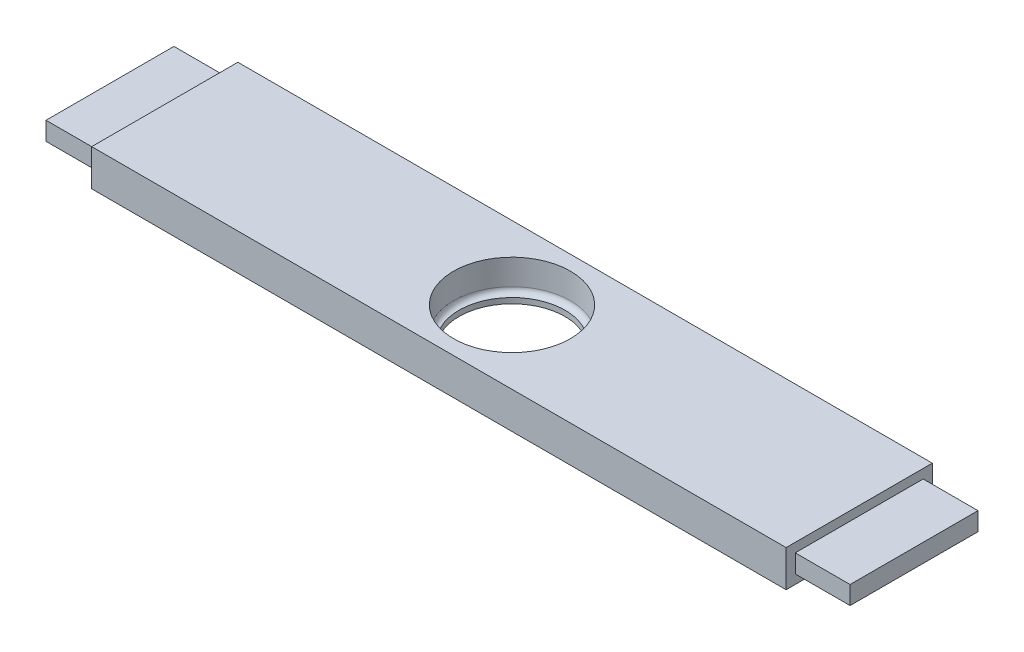
ISO-10303-21;
HEADER;
FILE_DESCRIPTION(('STEP AP214'),'2;1');
FILE_NAME('part.step','',(''),(''),'','','');
FILE_SCHEMA(('AUTOMOTIVE_DESIGN { 1 0 10303 214 1 1 1 1 }'));
ENDSEC;
DATA;
#1=APPLICATION_CONTEXT('core data for automotive mechanical design processes');
#2=APPLICATION_PROTOCOL_DEFINITION('international standard','automotive_design',2000,#1);
#3=PRODUCT_CONTEXT('',#1,'mechanical');
#4=PRODUCT('Part','Part','',(#3));
#5=PRODUCT_RELATED_PRODUCT_CATEGORY('part','',(#4));
#6=PRODUCT_DEFINITION_FORMATION('','',#4);
#7=PRODUCT_DEFINITION_CONTEXT('part definition',#1,'design');
#8=PRODUCT_DEFINITION('design','',#6,#7);
#9=PRODUCT_DEFINITION_SHAPE('','',#8);
#10=(LENGTH_UNIT() NAMED_UNIT(*) SI_UNIT(.MILLI.,.METRE.));
#11=(NAMED_UNIT(*) PLANE_ANGLE_UNIT() SI_UNIT($,.RADIAN.));
#12=(NAMED_UNIT(*) SI_UNIT($,.STERADIAN.) SOLID_ANGLE_UNIT());
#13=UNCERTAINTY_MEASURE_WITH_UNIT(LENGTH_MEASURE(1.E-05),#10,'distance_accuracy_value','');
#14=(GEOMETRIC_REPRESENTATION_CONTEXT(3) GLOBAL_UNCERTAINTY_ASSIGNED_CONTEXT((#13)) GLOBAL_UNIT_ASSIGNED_CONTEXT((#10,
#11,#12)) REPRESENTATION_CONTEXT('',''));
#15=CARTESIAN_POINT('',(0.,0.,0.));
#16=DIRECTION('',(0.,0.,1.));
#17=DIRECTION('',(1.,0.,0.));
#18=AXIS2_PLACEMENT_3D('',#15,#16,#17);
#19=CARTESIAN_POINT('',(0.,10.,0.));
#20=DIRECTION('',(0.,-1.,0.));
#21=DIRECTION('',(0.,0.,-1.));
#22=AXIS2_PLACEMENT_3D('',#19,#20,#21);
#23=PLANE('',#22);
#24=DIRECTION('',(0.,0.,-1.));
#25=VECTOR('',#24,1.);
#26=CARTESIAN_POINT('',(205.,10.,-40.));
#27=LINE('',#26,#25);
#28=CARTESIAN_POINT('',(205.,10.,0.));
#29=VERTEX_POINT('',#28);
#30=CARTESIAN_POINT('',(205.,10.,-40.));
#31=VERTEX_POINT('',#30);
#32=EDGE_CURVE('E175',#29,#31,#27,.T.);
#33=ORIENTED_EDGE('',*,*,#32,.T.);
#34=DIRECTION('',(-1.,0.,0.));
#35=VECTOR('',#34,1.);
#36=CARTESIAN_POINT('',(0.,10.,-40.));
#37=LINE('',#36,#35);
#38=CARTESIAN_POINT('',(15.,10.,-40.));
#39=VERTEX_POINT('',#38);
#40=EDGE_CURVE('E49',#31,#39,#37,.T.);
#41=ORIENTED_EDGE('',*,*,#40,.T.);
#42=DIRECTION('',(0.,0.,-1.));
#43=VECTOR('',#42,1.);
#44=CARTESIAN_POINT('',(15.,10.,-40.));
#45=LINE('',#44,#43);
#46=CARTESIAN_POINT('',(15.,10.,0.));
#47=VERTEX_POINT('',#46);
#48=EDGE_CURVE('E221',#47,#39,#45,.T.);
#49=ORIENTED_EDGE('',*,*,#48,.F.);
#50=DIRECTION('',(1.,0.,0.));
#51=VECTOR('',#50,1.);
#52=CARTESIAN_POINT('',(0.,10.,0.));
#53=LINE('',#52,#51);
#54=EDGE_CURVE('E225',#47,#29,#53,.T.);
#55=ORIENTED_EDGE('',*,*,#54,.T.);
#56=EDGE_LOOP('',(#33,#41,#49,#55));
#57=FACE_BOUND('',#56,.T.);
#58=CARTESIAN_POINT('',(110.,10.,-20.));
#59=DIRECTION('',(0.,-1.,0.));
#60=DIRECTION('',(0.,0.,-1.));
#61=AXIS2_PLACEMENT_3D('',#58,#59,#60);
#62=CIRCLE('',#61,16.);
#63=CARTESIAN_POINT('',(110.,10.,-36.));
#64=VERTEX_POINT('',#63);
#65=EDGE_CURVE('E234',#64,#64,#62,.F.);
#66=ORIENTED_EDGE('',*,*,#65,.F.);
#67=EDGE_LOOP('',(#66));
#68=FACE_BOUND('',#67,.T.);
#69=ADVANCED_FACE('F41',(#57,#68),#23,.F.);
#70=CARTESIAN_POINT('',(110.,-1.2E-05,-20.));
#71=DIRECTION('',(0.,1.,0.));
#72=DIRECTION('',(0.,0.,1.));
#73=AXIS2_PLACEMENT_3D('',#70,#71,#72);
#74=CYLINDRICAL_SURFACE('',#73,14.5);
#75=CARTESIAN_POINT('',(110.,0.,-20.));
#76=DIRECTION('',(0.,-1.,0.));
#77=DIRECTION('',(0.,0.,-1.));
#78=AXIS2_PLACEMENT_3D('',#75,#76,#77);
#79=CIRCLE('',#78,14.5);
#80=CARTESIAN_POINT('',(110.,0.,-5.50000000000001));
#81=VERTEX_POINT('',#80);
#82=EDGE_CURVE('E165',#81,#81,#79,.T.);
#83=CARTESIAN_POINT('',(110.,1.5,-20.));
#84=DIRECTION('',(0.,1.,0.));
#85=DIRECTION('',(0.,0.,1.));
#86=AXIS2_PLACEMENT_3D('',#83,#84,#85);
#87=CIRCLE('',#86,14.5);
#88=CARTESIAN_POINT('',(110.,1.5,-5.50000000000001));
#89=VERTEX_POINT('',#88);
#90=EDGE_CURVE('E159',#89,#89,#87,.T.);
#91=CARTESIAN_POINT('',(110.,0.,-5.50000000000001));
#92=CARTESIAN_POINT('',(110.,0.015625,-5.50000000000001));
#93=CARTESIAN_POINT('',(110.,0.03125,-5.50000000000001));
#94=CARTESIAN_POINT('',(110.,0.0625,-5.50000000000001));
#95=CARTESIAN_POINT('',(110.,0.078125,-5.50000000000001));
#96=CARTESIAN_POINT('',(110.,0.109375,-5.50000000000001));
#97=CARTESIAN_POINT('',(110.,0.125,-5.50000000000001));
#98=CARTESIAN_POINT('',(110.,0.15625,-5.50000000000001));
#99=CARTESIAN_POINT('',(110.,0.171875,-5.50000000000001));
#100=CARTESIAN_POINT('',(110.,0.203125,-5.50000000000001));
#101=CARTESIAN_POINT('',(110.,0.21875,-5.50000000000001));
#102=CARTESIAN_POINT('',(110.,0.25,-5.50000000000001));
#103=CARTESIAN_POINT('',(110.,0.265625,-5.50000000000001));
#104=CARTESIAN_POINT('',(110.,0.296875,-5.50000000000001));
#105=CARTESIAN_POINT('',(110.,0.3125,-5.50000000000001));
#106=CARTESIAN_POINT('',(110.,0.34375,-5.50000000000001));
#107=CARTESIAN_POINT('',(110.,0.359375,-5.50000000000001));
#108=CARTESIAN_POINT('',(110.,0.390625,-5.50000000000001));
#109=CARTESIAN_POINT('',(110.,0.40625,-5.50000000000001));
#110=CARTESIAN_POINT('',(110.,0.4375,-5.50000000000001));
#111=CARTESIAN_POINT('',(110.,0.453125,-5.50000000000001));
#112=CARTESIAN_POINT('',(110.,0.484375,-5.50000000000001));
#113=CARTESIAN_POINT('',(110.,0.5,-5.50000000000001));
#114=CARTESIAN_POINT('',(110.,0.53125,-5.50000000000001));
#115=CARTESIAN_POINT('',(110.,0.546875,-5.50000000000001));
#116=CARTESIAN_POINT('',(110.,0.578125,-5.50000000000001));
#117=CARTESIAN_POINT('',(110.,0.59375,-5.50000000000001));
#118=CARTESIAN_POINT('',(110.,0.625,-5.50000000000001));
#119=CARTESIAN_POINT('',(110.,0.640625,-5.50000000000001));
#120=CARTESIAN_POINT('',(110.,0.671875,-5.50000000000001));
#121=CARTESIAN_POINT('',(110.,0.6875,-5.50000000000001));
#122=CARTESIAN_POINT('',(110.,0.71875,-5.50000000000001));
#123=CARTESIAN_POINT('',(110.,0.734375,-5.50000000000001));
#124=CARTESIAN_POINT('',(110.,0.765625,-5.50000000000001));
#125=CARTESIAN_POINT('',(110.,0.78125,-5.50000000000001));
#126=CARTESIAN_POINT('',(110.,0.8125,-5.50000000000001));
#127=CARTESIAN_POINT('',(110.,0.828125,-5.50000000000001));
#128=CARTESIAN_POINT('',(110.,0.859375,-5.50000000000001));
#129=CARTESIAN_POINT('',(110.,0.875,-5.50000000000001));
#130=CARTESIAN_POINT('',(110.,0.90625,-5.50000000000001));
#131=CARTESIAN_POINT('',(110.,0.921875,-5.50000000000001));
#132=CARTESIAN_POINT('',(110.,0.953125,-5.50000000000001));
#133=CARTESIAN_POINT('',(110.,0.96875,-5.50000000000001));
#134=CARTESIAN_POINT('',(110.,1.,-5.50000000000001));
#135=CARTESIAN_POINT('',(110.,1.015625,-5.50000000000001));
#136=CARTESIAN_POINT('',(110.,1.046875,-5.50000000000001));
#137=CARTESIAN_POINT('',(110.,1.0625,-5.50000000000001));
#138=CARTESIAN_POINT('',(110.,1.09375,-5.50000000000001));
#139=CARTESIAN_POINT('',(110.,1.109375,-5.50000000000001));
#140=CARTESIAN_POINT('',(110.,1.140625,-5.50000000000001));
#141=CARTESIAN_POINT('',(110.,1.15625,-5.50000000000001));
#142=CARTESIAN_POINT('',(110.,1.1875,-5.50000000000001));
#143=CARTESIAN_POINT('',(110.,1.203125,-5.50000000000001));
#144=CARTESIAN_POINT('',(110.,1.234375,-5.50000000000001));
#145=CARTESIAN_POINT('',(110.,1.25,-5.50000000000001));
#146=CARTESIAN_POINT('',(110.,1.28125,-5.50000000000001));
#147=CARTESIAN_POINT('',(110.,1.296875,-5.50000000000001));
#148=CARTESIAN_POINT('',(110.,1.328125,-5.50000000000001));
#149=CARTESIAN_POINT('',(110.,1.34375,-5.50000000000001));
#150=CARTESIAN_POINT('',(110.,1.375,-5.50000000000001));
#151=CARTESIAN_POINT('',(110.,1.390625,-5.50000000000001));
#152=CARTESIAN_POINT('',(110.,1.421875,-5.50000000000001));
#153=CARTESIAN_POINT('',(110.,1.4375,-5.50000000000001));
#154=CARTESIAN_POINT('',(110.,1.46875,-5.50000000000001));
#155=CARTESIAN_POINT('',(110.,1.484375,-5.50000000000001));
#156=CARTESIAN_POINT('',(110.,1.5,-5.50000000000001));
#157=B_SPLINE_CURVE_WITH_KNOTS('',3,(#91,#92,#93,#94,#95,#96,#97,#98,#99,#100,#101,#102,#103,
#104,#105,#106,#107,#108,#109,#110,#111,#112,#113,#114,#115,#116,#117,#118,#119,#120,#121,#122,
#123,#124,#125,#126,#127,#128,#129,#130,#131,#132,#133,#134,#135,#136,#137,#138,#139,#140,#141,
#142,#143,#144,#145,#146,#147,#148,#149,#150,#151,#152,#153,#154,#155,#156),.UNSPECIFIED.,.F.,
.F.,(4,2,2,2,2,2,2,2,2,2,2,2,2,2,2,2,2,2,2,2,2,2,2,2,2,2,2,2,2,2,2,2,4),(0.,0.046875,0.09375,
0.140625,0.1875,0.234375,0.28125,0.328125,0.375,0.421875,0.46875,0.515625,0.5625,0.609375,
0.65625,0.703125,0.75,0.796875,0.84375,0.890625,0.9375,0.984375,1.03125,1.078125,1.125,1.171875,
1.21875,1.265625,1.3125,1.359375,1.40625,1.453125,1.5),.UNSPECIFIED.);
#158=EDGE_CURVE('BSEAM241',#81,#89,#157,.T.);
#159=ORIENTED_EDGE('',*,*,#82,.T.);
#160=ORIENTED_EDGE('',*,*,#90,.T.);
#161=ORIENTED_EDGE('',*,*,#158,.T.);
#162=ORIENTED_EDGE('',*,*,#158,.F.);
#163=EDGE_LOOP('',(#159,#161,#160,#162));
#164=FACE_BOUND('',#163,.T.);
#165=ADVANCED_FACE('F241',(#164),#74,.F.);
#166=CARTESIAN_POINT('',(0.,10.,0.));
#167=DIRECTION('',(0.,0.,-1.));
#168=DIRECTION('',(-1.,0.,0.));
#169=AXIS2_PLACEMENT_3D('',#166,#167,#168);
#170=PLANE('',#169);
#171=DIRECTION('',(0.,1.,0.));
#172=VECTOR('',#171,1.);
#173=CARTESIAN_POINT('',(205.,10.,0.));
#174=LINE('',#173,#172);
#175=CARTESIAN_POINT('',(205.,0.,0.));
#176=VERTEX_POINT('',#175);
#177=EDGE_CURVE('E56',#176,#29,#174,.T.);
#178=ORIENTED_EDGE('',*,*,#177,.T.);
#179=ORIENTED_EDGE('',*,*,#54,.F.);
#180=DIRECTION('',(0.,1.,0.));
#181=VECTOR('',#180,1.);
#182=CARTESIAN_POINT('',(15.,10.,0.));
#183=LINE('',#182,#181);
#184=CARTESIAN_POINT('',(15.,0.,0.));
#185=VERTEX_POINT('',#184);
#186=EDGE_CURVE('E219',#185,#47,#183,.T.);
#187=ORIENTED_EDGE('',*,*,#186,.F.);
#188=DIRECTION('',(1.,0.,0.));
#189=VECTOR('',#188,1.);
#190=CARTESIAN_POINT('',(0.,0.,0.));
#191=LINE('',#190,#189);
#192=EDGE_CURVE('E224',#185,#176,#191,.T.);
#193=ORIENTED_EDGE('',*,*,#192,.T.);
#194=EDGE_LOOP('',(#178,#179,#187,#193));
#195=FACE_BOUND('',#194,.T.);
#196=ADVANCED_FACE('F260',(#195),#170,.F.);
#197=CARTESIAN_POINT('',(0.,10.,-40.));
#198=DIRECTION('',(0.,0.,1.));
#199=DIRECTION('',(1.,0.,0.));
#200=AXIS2_PLACEMENT_3D('',#197,#198,#199);
#201=PLANE('',#200);
#202=DIRECTION('',(0.,-1.,0.));
#203=VECTOR('',#202,1.);
#204=CARTESIAN_POINT('',(205.,10.,-40.));
#205=LINE('',#204,#203);
#206=CARTESIAN_POINT('',(205.,0.,-40.));
#207=VERTEX_POINT('',#206);
#208=EDGE_CURVE('E169',#31,#207,#205,.T.);
#209=ORIENTED_EDGE('',*,*,#208,.T.);
#210=DIRECTION('',(-1.,0.,0.));
#211=VECTOR('',#210,1.);
#212=CARTESIAN_POINT('',(0.,0.,-40.));
#213=LINE('',#212,#211);
#214=CARTESIAN_POINT('',(15.,0.,-40.));
#215=VERTEX_POINT('',#214);
#216=EDGE_CURVE('E228',#207,#215,#213,.T.);
#217=ORIENTED_EDGE('',*,*,#216,.T.);
#218=DIRECTION('',(0.,-1.,0.));
#219=VECTOR('',#218,1.);
#220=CARTESIAN_POINT('',(15.,10.,-40.));
#221=LINE('',#220,#219);
#222=EDGE_CURVE('E208',#39,#215,#221,.T.);
#223=ORIENTED_EDGE('',*,*,#222,.F.);
#224=ORIENTED_EDGE('',*,*,#40,.F.);
#225=EDGE_LOOP('',(#209,#217,#223,#224));
#226=FACE_BOUND('',#225,.T.);
#227=ADVANCED_FACE('F270',(#226),#201,.F.);
#228=CARTESIAN_POINT('',(0.,0.,0.));
#229=DIRECTION('',(0.,-1.,0.));
#230=DIRECTION('',(0.,0.,-1.));
#231=AXIS2_PLACEMENT_3D('',#228,#229,#230);
#232=PLANE('',#231);
#233=ORIENTED_EDGE('',*,*,#82,.F.);
#234=EDGE_LOOP('',(#233));
#235=FACE_BOUND('',#234,.T.);
#236=ORIENTED_EDGE('',*,*,#216,.F.);
#237=DIRECTION('',(0.,0.,1.));
#238=VECTOR('',#237,1.);
#239=CARTESIAN_POINT('',(205.,0.,-40.));
#240=LINE('',#239,#238);
#241=EDGE_CURVE('E179',#207,#176,#240,.T.);
#242=ORIENTED_EDGE('',*,*,#241,.T.);
#243=ORIENTED_EDGE('',*,*,#192,.F.);
#244=DIRECTION('',(0.,0.,1.));
#245=VECTOR('',#244,1.);
#246=CARTESIAN_POINT('',(15.,0.,-40.));
#247=LINE('',#246,#245);
#248=EDGE_CURVE('E217',#215,#185,#247,.T.);
#249=ORIENTED_EDGE('',*,*,#248,.F.);
#250=EDGE_LOOP('',(#236,#242,#243,#249));
#251=FACE_BOUND('',#250,.T.);
#252=ADVANCED_FACE('F268',(#235,#251),#232,.T.);
#253=CARTESIAN_POINT('',(15.,0.,0.));
#254=DIRECTION('',(-1.,0.,0.));
#255=DIRECTION('',(0.,0.,1.));
#256=AXIS2_PLACEMENT_3D('',#253,#254,#255);
#257=PLANE('',#256);
#258=DIRECTION('',(0.,0.,1.));
#259=VECTOR('',#258,1.);
#260=CARTESIAN_POINT('',(15.,2.5,-2.5));
#261=LINE('',#260,#259);
#262=CARTESIAN_POINT('',(15.,2.5,-37.5));
#263=VERTEX_POINT('',#262);
#264=CARTESIAN_POINT('',(15.,2.5,-2.5));
#265=VERTEX_POINT('',#264);
#266=EDGE_CURVE('E192',#263,#265,#261,.T.);
#267=ORIENTED_EDGE('',*,*,#266,.F.);
#268=DIRECTION('',(0.,-1.,0.));
#269=VECTOR('',#268,1.);
#270=CARTESIAN_POINT('',(15.,2.5,-37.5));
#271=LINE('',#270,#269);
#272=CARTESIAN_POINT('',(15.,7.5,-37.5));
#273=VERTEX_POINT('',#272);
#274=EDGE_CURVE('E189',#273,#263,#271,.T.);
#275=ORIENTED_EDGE('',*,*,#274,.F.);
#276=DIRECTION('',(0.,0.,-1.));
#277=VECTOR('',#276,1.);
#278=CARTESIAN_POINT('',(15.,7.5,-2.5));
#279=LINE('',#278,#277);
#280=CARTESIAN_POINT('',(15.,7.5,-2.5));
#281=VERTEX_POINT('',#280);
#282=EDGE_CURVE('E185',#281,#273,#279,.T.);
#283=ORIENTED_EDGE('',*,*,#282,.F.);
#284=DIRECTION('',(0.,1.,0.));
#285=VECTOR('',#284,1.);
#286=CARTESIAN_POINT('',(15.,2.5,-2.5));
#287=LINE('',#286,#285);
#288=EDGE_CURVE('E182',#265,#281,#287,.T.);
#289=ORIENTED_EDGE('',*,*,#288,.F.);
#290=EDGE_LOOP('',(#267,#275,#283,#289));
#291=FACE_BOUND('',#290,.T.);
#292=ORIENTED_EDGE('',*,*,#222,.T.);
#293=ORIENTED_EDGE('',*,*,#248,.T.);
#294=ORIENTED_EDGE('',*,*,#186,.T.);
#295=ORIENTED_EDGE('',*,*,#48,.T.);
#296=EDGE_LOOP('',(#292,#293,#294,#295));
#297=FACE_BOUND('',#296,.T.);
#298=ADVANCED_FACE('F266',(#291,#297),#257,.T.);
#299=CARTESIAN_POINT('',(15.,2.5,-2.5));
#300=DIRECTION('',(0.,0.,1.));
#301=DIRECTION('',(0.,-1.,0.));
#302=AXIS2_PLACEMENT_3D('',#299,#300,#301);
#303=PLANE('',#302);
#304=DIRECTION('',(0.,1.,0.));
#305=VECTOR('',#304,1.);
#306=CARTESIAN_POINT('',(0.,2.5,-2.5));
#307=LINE('',#306,#305);
#308=CARTESIAN_POINT('',(0.,2.5,-2.5));
#309=VERTEX_POINT('',#308);
#310=CARTESIAN_POINT('',(0.,7.5,-2.5));
#311=VERTEX_POINT('',#310);
#312=EDGE_CURVE('E181',#309,#311,#307,.T.);
#313=ORIENTED_EDGE('',*,*,#312,.F.);
#314=DIRECTION('',(-1.,0.,0.));
#315=VECTOR('',#314,1.);
#316=CARTESIAN_POINT('',(15.,2.5,-2.5));
#317=LINE('',#316,#315);
#318=EDGE_CURVE('E206',#265,#309,#317,.T.);
#319=ORIENTED_EDGE('',*,*,#318,.F.);
#320=ORIENTED_EDGE('',*,*,#288,.T.);
#321=DIRECTION('',(-1.,0.,0.));
#322=VECTOR('',#321,1.);
#323=CARTESIAN_POINT('',(15.,7.5,-2.5));
#324=LINE('',#323,#322);
#325=EDGE_CURVE('E195',#281,#311,#324,.T.);
#326=ORIENTED_EDGE('',*,*,#325,.T.);
#327=EDGE_LOOP('',(#313,#319,#320,#326));
#328=FACE_BOUND('',#327,.T.);
#329=ADVANCED_FACE('F296',(#328),#303,.T.);
#330=CARTESIAN_POINT('',(15.,2.5,-2.5));
#331=DIRECTION('',(0.,-1.,0.));
#332=DIRECTION('',(0.,0.,-1.));
#333=AXIS2_PLACEMENT_3D('',#330,#331,#332);
#334=PLANE('',#333);
#335=DIRECTION('',(0.,0.,1.));
#336=VECTOR('',#335,1.);
#337=CARTESIAN_POINT('',(0.,2.5,-2.5));
#338=LINE('',#337,#336);
#339=CARTESIAN_POINT('',(0.,2.5,-37.5));
#340=VERTEX_POINT('',#339);
#341=EDGE_CURVE('E186',#340,#309,#338,.T.);
#342=ORIENTED_EDGE('',*,*,#341,.F.);
#343=DIRECTION('',(-1.,0.,0.));
#344=VECTOR('',#343,1.);
#345=CARTESIAN_POINT('',(15.,2.5,-37.5));
#346=LINE('',#345,#344);
#347=EDGE_CURVE('E209',#263,#340,#346,.T.);
#348=ORIENTED_EDGE('',*,*,#347,.F.);
#349=ORIENTED_EDGE('',*,*,#266,.T.);
#350=ORIENTED_EDGE('',*,*,#318,.T.);
#351=EDGE_LOOP('',(#342,#348,#349,#350));
#352=FACE_BOUND('',#351,.T.);
#353=ADVANCED_FACE('F303',(#352),#334,.T.);
#354=CARTESIAN_POINT('',(15.,2.5,-37.5));
#355=DIRECTION('',(0.,0.,-1.));
#356=DIRECTION('',(-1.,0.,0.));
#357=AXIS2_PLACEMENT_3D('',#354,#355,#356);
#358=PLANE('',#357);
#359=DIRECTION('',(0.,-1.,0.));
#360=VECTOR('',#359,1.);
#361=CARTESIAN_POINT('',(0.,2.5,-37.5));
#362=LINE('',#361,#360);
#363=CARTESIAN_POINT('',(0.,7.5,-37.5));
#364=VERTEX_POINT('',#363);
#365=EDGE_CURVE('E201',#364,#340,#362,.T.);
#366=ORIENTED_EDGE('',*,*,#365,.F.);
#367=DIRECTION('',(-1.,0.,0.));
#368=VECTOR('',#367,1.);
#369=CARTESIAN_POINT('',(15.,7.5,-37.5));
#370=LINE('',#369,#368);
#371=EDGE_CURVE('E211',#273,#364,#370,.T.);
#372=ORIENTED_EDGE('',*,*,#371,.F.);
#373=ORIENTED_EDGE('',*,*,#274,.T.);
#374=ORIENTED_EDGE('',*,*,#347,.T.);
#375=EDGE_LOOP('',(#366,#372,#373,#374));
#376=FACE_BOUND('',#375,.T.);
#377=ADVANCED_FACE('F289',(#376),#358,.T.);
#378=CARTESIAN_POINT('',(15.,7.5,-2.5));
#379=DIRECTION('',(0.,1.,0.));
#380=DIRECTION('',(0.,0.,1.));
#381=AXIS2_PLACEMENT_3D('',#378,#379,#380);
#382=PLANE('',#381);
#383=DIRECTION('',(0.,0.,-1.));
#384=VECTOR('',#383,1.);
#385=CARTESIAN_POINT('',(0.,7.5,-2.5));
#386=LINE('',#385,#384);
#387=EDGE_CURVE('E198',#311,#364,#386,.T.);
#388=ORIENTED_EDGE('',*,*,#387,.F.);
#389=ORIENTED_EDGE('',*,*,#325,.F.);
#390=ORIENTED_EDGE('',*,*,#282,.T.);
#391=ORIENTED_EDGE('',*,*,#371,.T.);
#392=EDGE_LOOP('',(#388,#389,#390,#391));
#393=FACE_BOUND('',#392,.T.);
#394=ADVANCED_FACE('F282',(#393),#382,.T.);
#395=CARTESIAN_POINT('',(0.,10.,0.));
#396=DIRECTION('',(1.,0.,0.));
#397=DIRECTION('',(0.,0.,-1.));
#398=AXIS2_PLACEMENT_3D('',#395,#396,#397);
#399=PLANE('',#398);
#400=ORIENTED_EDGE('',*,*,#312,.T.);
#401=ORIENTED_EDGE('',*,*,#387,.T.);
#402=ORIENTED_EDGE('',*,*,#365,.T.);
#403=ORIENTED_EDGE('',*,*,#341,.T.);
#404=EDGE_LOOP('',(#400,#401,#402,#403));
#405=FACE_BOUND('',#404,.T.);
#406=ADVANCED_FACE('F280',(#405),#399,.F.);
#407=CARTESIAN_POINT('',(205.,0.,0.));
#408=DIRECTION('',(1.,0.,0.));
#409=DIRECTION('',(0.,0.,1.));
#410=AXIS2_PLACEMENT_3D('',#407,#408,#409);
#411=PLANE('',#410);
#412=ORIENTED_EDGE('',*,*,#208,.F.);
#413=ORIENTED_EDGE('',*,*,#32,.F.);
#414=ORIENTED_EDGE('',*,*,#177,.F.);
#415=ORIENTED_EDGE('',*,*,#241,.F.);
#416=EDGE_LOOP('',(#412,#413,#414,#415));
#417=FACE_BOUND('',#416,.T.);
#418=DIRECTION('',(0.,1.,0.));
#419=VECTOR('',#418,1.);
#420=CARTESIAN_POINT('',(205.,2.5,-2.5));
#421=LINE('',#420,#419);
#422=CARTESIAN_POINT('',(205.,2.5,-2.5));
#423=VERTEX_POINT('',#422);
#424=CARTESIAN_POINT('',(205.,7.5,-2.5));
#425=VERTEX_POINT('',#424);
#426=EDGE_CURVE('E134',#423,#425,#421,.T.);
#427=ORIENTED_EDGE('',*,*,#426,.T.);
#428=DIRECTION('',(0.,0.,-1.));
#429=VECTOR('',#428,1.);
#430=CARTESIAN_POINT('',(205.,7.5,-2.5));
#431=LINE('',#430,#429);
#432=CARTESIAN_POINT('',(205.,7.5,-37.5));
#433=VERTEX_POINT('',#432);
#434=EDGE_CURVE('E149',#425,#433,#431,.T.);
#435=ORIENTED_EDGE('',*,*,#434,.T.);
#436=DIRECTION('',(0.,-1.,0.));
#437=VECTOR('',#436,1.);
#438=CARTESIAN_POINT('',(205.,2.5,-37.5));
#439=LINE('',#438,#437);
#440=CARTESIAN_POINT('',(205.,2.5,-37.5));
#441=VERTEX_POINT('',#440);
#442=EDGE_CURVE('E137',#433,#441,#439,.T.);
#443=ORIENTED_EDGE('',*,*,#442,.T.);
#444=DIRECTION('',(0.,0.,1.));
#445=VECTOR('',#444,1.);
#446=CARTESIAN_POINT('',(205.,2.5,-2.5));
#447=LINE('',#446,#445);
#448=EDGE_CURVE('E130',#441,#423,#447,.T.);
#449=ORIENTED_EDGE('',*,*,#448,.T.);
#450=EDGE_LOOP('',(#427,#435,#443,#449));
#451=FACE_BOUND('',#450,.T.);
#452=ADVANCED_FACE('F132',(#417,#451),#411,.T.);
#453=CARTESIAN_POINT('',(205.,2.5,-2.5));
#454=DIRECTION('',(0.,0.,-1.));
#455=DIRECTION('',(0.,1.,0.));
#456=AXIS2_PLACEMENT_3D('',#453,#454,#455);
#457=PLANE('',#456);
#458=DIRECTION('',(0.,1.,0.));
#459=VECTOR('',#458,1.);
#460=CARTESIAN_POINT('',(220.,2.5,-2.5));
#461=LINE('',#460,#459);
#462=CARTESIAN_POINT('',(220.,2.5,-2.5));
#463=VERTEX_POINT('',#462);
#464=CARTESIAN_POINT('',(220.,7.5,-2.5));
#465=VERTEX_POINT('',#464);
#466=EDGE_CURVE('E163',#463,#465,#461,.T.);
#467=ORIENTED_EDGE('',*,*,#466,.T.);
#468=DIRECTION('',(1.,0.,0.));
#469=VECTOR('',#468,1.);
#470=CARTESIAN_POINT('',(205.,7.5,-2.5));
#471=LINE('',#470,#469);
#472=EDGE_CURVE('E152',#425,#465,#471,.T.);
#473=ORIENTED_EDGE('',*,*,#472,.F.);
#474=ORIENTED_EDGE('',*,*,#426,.F.);
#475=DIRECTION('',(1.,0.,0.));
#476=VECTOR('',#475,1.);
#477=CARTESIAN_POINT('',(205.,2.5,-2.5));
#478=LINE('',#477,#476);
#479=EDGE_CURVE('E141',#423,#463,#478,.T.);
#480=ORIENTED_EDGE('',*,*,#479,.T.);
#481=EDGE_LOOP('',(#467,#473,#474,#480));
#482=FACE_BOUND('',#481,.T.);
#483=ADVANCED_FACE('F151',(#482),#457,.F.);
#484=CARTESIAN_POINT('',(205.,7.5,-2.5));
#485=DIRECTION('',(0.,-1.,0.));
#486=DIRECTION('',(0.,0.,-1.));
#487=AXIS2_PLACEMENT_3D('',#484,#485,#486);
#488=PLANE('',#487);
#489=DIRECTION('',(0.,0.,-1.));
#490=VECTOR('',#489,1.);
#491=CARTESIAN_POINT('',(220.,7.5,-2.5));
#492=LINE('',#491,#490);
#493=CARTESIAN_POINT('',(220.,7.5,-37.5));
#494=VERTEX_POINT('',#493);
#495=EDGE_CURVE('E154',#465,#494,#492,.T.);
#496=ORIENTED_EDGE('',*,*,#495,.T.);
#497=DIRECTION('',(1.,0.,0.));
#498=VECTOR('',#497,1.);
#499=CARTESIAN_POINT('',(205.,7.5,-37.5));
#500=LINE('',#499,#498);
#501=EDGE_CURVE('E170',#433,#494,#500,.T.);
#502=ORIENTED_EDGE('',*,*,#501,.F.);
#503=ORIENTED_EDGE('',*,*,#434,.F.);
#504=ORIENTED_EDGE('',*,*,#472,.T.);
#505=EDGE_LOOP('',(#496,#502,#503,#504));
#506=FACE_BOUND('',#505,.T.);
#507=ADVANCED_FACE('F328',(#506),#488,.F.);
#508=CARTESIAN_POINT('',(205.,2.5,-37.5));
#509=DIRECTION('',(0.,0.,1.));
#510=DIRECTION('',(1.,0.,0.));
#511=AXIS2_PLACEMENT_3D('',#508,#509,#510);
#512=PLANE('',#511);
#513=DIRECTION('',(0.,-1.,0.));
#514=VECTOR('',#513,1.);
#515=CARTESIAN_POINT('',(220.,2.5,-37.5));
#516=LINE('',#515,#514);
#517=CARTESIAN_POINT('',(220.,2.5,-37.5));
#518=VERTEX_POINT('',#517);
#519=EDGE_CURVE('E64',#494,#518,#516,.T.);
#520=ORIENTED_EDGE('',*,*,#519,.T.);
#521=DIRECTION('',(1.,0.,0.));
#522=VECTOR('',#521,1.);
#523=CARTESIAN_POINT('',(205.,2.5,-37.5));
#524=LINE('',#523,#522);
#525=EDGE_CURVE('E148',#441,#518,#524,.T.);
#526=ORIENTED_EDGE('',*,*,#525,.F.);
#527=ORIENTED_EDGE('',*,*,#442,.F.);
#528=ORIENTED_EDGE('',*,*,#501,.T.);
#529=EDGE_LOOP('',(#520,#526,#527,#528));
#530=FACE_BOUND('',#529,.T.);
#531=ADVANCED_FACE('F331',(#530),#512,.F.);
#532=CARTESIAN_POINT('',(205.,2.5,-2.5));
#533=DIRECTION('',(0.,1.,0.));
#534=DIRECTION('',(0.,0.,1.));
#535=AXIS2_PLACEMENT_3D('',#532,#533,#534);
#536=PLANE('',#535);
#537=DIRECTION('',(0.,0.,1.));
#538=VECTOR('',#537,1.);
#539=CARTESIAN_POINT('',(220.,2.5,-2.5));
#540=LINE('',#539,#538);
#541=EDGE_CURVE('E144',#518,#463,#540,.T.);
#542=ORIENTED_EDGE('',*,*,#541,.T.);
#543=ORIENTED_EDGE('',*,*,#479,.F.);
#544=ORIENTED_EDGE('',*,*,#448,.F.);
#545=ORIENTED_EDGE('',*,*,#525,.T.);
#546=EDGE_LOOP('',(#542,#543,#544,#545));
#547=FACE_BOUND('',#546,.T.);
#548=ADVANCED_FACE('F142',(#547),#536,.F.);
#549=CARTESIAN_POINT('',(220.,10.,0.));
#550=DIRECTION('',(-1.,0.,0.));
#551=DIRECTION('',(0.,0.,1.));
#552=AXIS2_PLACEMENT_3D('',#549,#550,#551);
#553=PLANE('',#552);
#554=ORIENTED_EDGE('',*,*,#495,.F.);
#555=ORIENTED_EDGE('',*,*,#466,.F.);
#556=ORIENTED_EDGE('',*,*,#541,.F.);
#557=ORIENTED_EDGE('',*,*,#519,.F.);
#558=EDGE_LOOP('',(#554,#555,#556,#557));
#559=FACE_BOUND('',#558,.T.);
#560=ADVANCED_FACE('F249',(#559),#553,.F.);
#561=CARTESIAN_POINT('',(110.,10.000012,-20.));
#562=DIRECTION('',(0.,-1.,0.));
#563=DIRECTION('',(0.,0.,-1.));
#564=AXIS2_PLACEMENT_3D('',#561,#562,#563);
#565=CYLINDRICAL_SURFACE('',#564,16.);
#566=CARTESIAN_POINT('',(110.,3.,-20.));
#567=DIRECTION('',(0.,1.,0.));
#568=DIRECTION('',(0.,0.,1.));
#569=AXIS2_PLACEMENT_3D('',#566,#567,#568);
#570=CIRCLE('',#569,16.);
#571=CARTESIAN_POINT('',(110.,3.,-36.));
#572=VERTEX_POINT('',#571);
#573=EDGE_CURVE('E11',#572,#572,#570,.F.);
#574=CARTESIAN_POINT('',(110.,3.,-36.));
#575=CARTESIAN_POINT('',(110.,3.07291666666666,-36.));
#576=CARTESIAN_POINT('',(110.,3.14583333333333,-36.));
#577=CARTESIAN_POINT('',(110.,3.29166666666667,-36.));
#578=CARTESIAN_POINT('',(110.,3.36458333333333,-36.));
#579=CARTESIAN_POINT('',(110.,3.51041666666667,-36.));
#580=CARTESIAN_POINT('',(110.,3.58333333333333,-36.));
#581=CARTESIAN_POINT('',(110.,3.72916666666667,-36.));
#582=CARTESIAN_POINT('',(110.,3.80208333333333,-36.));
#583=CARTESIAN_POINT('',(110.,3.94791666666667,-36.));
#584=CARTESIAN_POINT('',(110.,4.02083333333333,-36.));
#585=CARTESIAN_POINT('',(110.,4.16666666666667,-36.));
#586=CARTESIAN_POINT('',(110.,4.23958333333333,-36.));
#587=CARTESIAN_POINT('',(110.,4.38541666666667,-36.));
#588=CARTESIAN_POINT('',(110.,4.45833333333333,-36.));
#589=CARTESIAN_POINT('',(110.,4.60416666666667,-36.));
#590=CARTESIAN_POINT('',(110.,4.67708333333333,-36.));
#591=CARTESIAN_POINT('',(110.,4.82291666666667,-36.));
#592=CARTESIAN_POINT('',(110.,4.89583333333333,-36.));
#593=CARTESIAN_POINT('',(110.,5.04166666666667,-36.));
#594=CARTESIAN_POINT('',(110.,5.11458333333333,-36.));
#595=CARTESIAN_POINT('',(110.,5.26041666666667,-36.));
#596=CARTESIAN_POINT('',(110.,5.33333333333333,-36.));
#597=CARTESIAN_POINT('',(110.,5.47916666666667,-36.));
#598=CARTESIAN_POINT('',(110.,5.55208333333333,-36.));
#599=CARTESIAN_POINT('',(110.,5.69791666666667,-36.));
#600=CARTESIAN_POINT('',(110.,5.77083333333333,-36.));
#601=CARTESIAN_POINT('',(110.,5.91666666666667,-36.));
#602=CARTESIAN_POINT('',(110.,5.98958333333333,-36.));
#603=CARTESIAN_POINT('',(110.,6.13541666666667,-36.));
#604=CARTESIAN_POINT('',(110.,6.20833333333333,-36.));
#605=CARTESIAN_POINT('',(110.,6.35416666666667,-36.));
#606=CARTESIAN_POINT('',(110.,6.42708333333333,-36.));
#607=CARTESIAN_POINT('',(110.,6.57291666666667,-36.));
#608=CARTESIAN_POINT('',(110.,6.64583333333333,-36.));
#609=CARTESIAN_POINT('',(110.,6.79166666666667,-36.));
#610=CARTESIAN_POINT('',(110.,6.86458333333333,-36.));
#611=CARTESIAN_POINT('',(110.,7.01041666666667,-36.));
#612=CARTESIAN_POINT('',(110.,7.08333333333333,-36.));
#613=CARTESIAN_POINT('',(110.,7.22916666666667,-36.));
#614=CARTESIAN_POINT('',(110.,7.30208333333333,-36.));
#615=CARTESIAN_POINT('',(110.,7.44791666666667,-36.));
#616=CARTESIAN_POINT('',(110.,7.52083333333333,-36.));
#617=CARTESIAN_POINT('',(110.,7.66666666666667,-36.));
#618=CARTESIAN_POINT('',(110.,7.73958333333333,-36.));
#619=CARTESIAN_POINT('',(110.,7.88541666666667,-36.));
#620=CARTESIAN_POINT('',(110.,7.95833333333333,-36.));
#621=CARTESIAN_POINT('',(110.,8.10416666666667,-36.));
#622=CARTESIAN_POINT('',(110.,8.17708333333333,-36.));
#623=CARTESIAN_POINT('',(110.,8.32291666666667,-36.));
#624=CARTESIAN_POINT('',(110.,8.39583333333333,-36.));
#625=CARTESIAN_POINT('',(110.,8.54166666666667,-36.));
#626=CARTESIAN_POINT('',(110.,8.61458333333333,-36.));
#627=CARTESIAN_POINT('',(110.,8.76041666666667,-36.));
#628=CARTESIAN_POINT('',(110.,8.83333333333333,-36.));
#629=CARTESIAN_POINT('',(110.,8.97916666666667,-36.));
#630=CARTESIAN_POINT('',(110.,9.05208333333333,-36.));
#631=CARTESIAN_POINT('',(110.,9.19791666666667,-36.));
#632=CARTESIAN_POINT('',(110.,9.27083333333333,-36.));
#633=CARTESIAN_POINT('',(110.,9.41666666666667,-36.));
#634=CARTESIAN_POINT('',(110.,9.48958333333333,-36.));
#635=CARTESIAN_POINT('',(110.,9.63541666666667,-36.));
#636=CARTESIAN_POINT('',(110.,9.70833333333333,-36.));
#637=CARTESIAN_POINT('',(110.,9.85416666666667,-36.));
#638=CARTESIAN_POINT('',(110.,9.92708333333333,-36.));
#639=CARTESIAN_POINT('',(110.,10.,-36.));
#640=B_SPLINE_CURVE_WITH_KNOTS('',3,(#574,#575,#576,#577,#578,#579,#580,#581,#582,#583,#584,
#585,#586,#587,#588,#589,#590,#591,#592,#593,#594,#595,#596,#597,#598,#599,#600,#601,#602,#603,
#604,#605,#606,#607,#608,#609,#610,#611,#612,#613,#614,#615,#616,#617,#618,#619,#620,#621,#622,
#623,#624,#625,#626,#627,#628,#629,#630,#631,#632,#633,#634,#635,#636,#637,#638,#639),
.UNSPECIFIED.,.F.,.F.,(4,2,2,2,2,2,2,2,2,2,2,2,2,2,2,2,2,2,2,2,2,2,2,2,2,2,2,2,2,2,2,2,4),(0.,
0.21875,0.4375,0.656250000000001,0.875000000000001,1.09375,1.3125,1.53125,1.75,1.96875,2.1875,
2.40625,2.625,2.84375,3.0625,3.28125,3.5,3.71875,3.9375,4.15625,4.375,4.59375,4.8125,5.03125,
5.25,5.46875,5.6875,5.90625,6.125,6.34375,6.5625,6.78125,7.),.UNSPECIFIED.);
#641=EDGE_CURVE('BSEAM244',#572,#64,#640,.T.);
#642=ORIENTED_EDGE('',*,*,#573,.T.);
#643=ORIENTED_EDGE('',*,*,#65,.T.);
#644=ORIENTED_EDGE('',*,*,#641,.T.);
#645=ORIENTED_EDGE('',*,*,#641,.F.);
#646=EDGE_LOOP('',(#642,#644,#643,#645));
#647=FACE_BOUND('',#646,.T.);
#648=ADVANCED_FACE('F244',(#647),#565,.F.);
#649=CARTESIAN_POINT('',(110.,3.,-20.));
#650=DIRECTION('',(0.,1.,0.));
#651=DIRECTION('',(0.,0.,1.));
#652=AXIS2_PLACEMENT_3D('',#649,#650,#651);
#653=TOROIDAL_SURFACE('',#652,14.5,1.5);
#654=ORIENTED_EDGE('',*,*,#573,.F.);
#655=EDGE_LOOP('',(#654));
#656=FACE_BOUND('',#655,.T.);
#657=ORIENTED_EDGE('',*,*,#90,.F.);
#658=EDGE_LOOP('',(#657));
#659=FACE_BOUND('',#658,.T.);
#660=ADVANCED_FACE('F43',(#656,#659),#653,.F.);
#661=CLOSED_SHELL('',(#69,#165,#196,#227,#252,#298,#329,#353,#377,#394,#406,#452,#483,#507,#531,
#548,#560,#648,#660));
#662=MANIFOLD_SOLID_BREP('B2',#661);
#663=ADVANCED_BREP_SHAPE_REPRESENTATION('',(#18,#662),#14);
#664=SHAPE_DEFINITION_REPRESENTATION(#9,#663);
ENDSEC;
END-ISO-10303-21;
